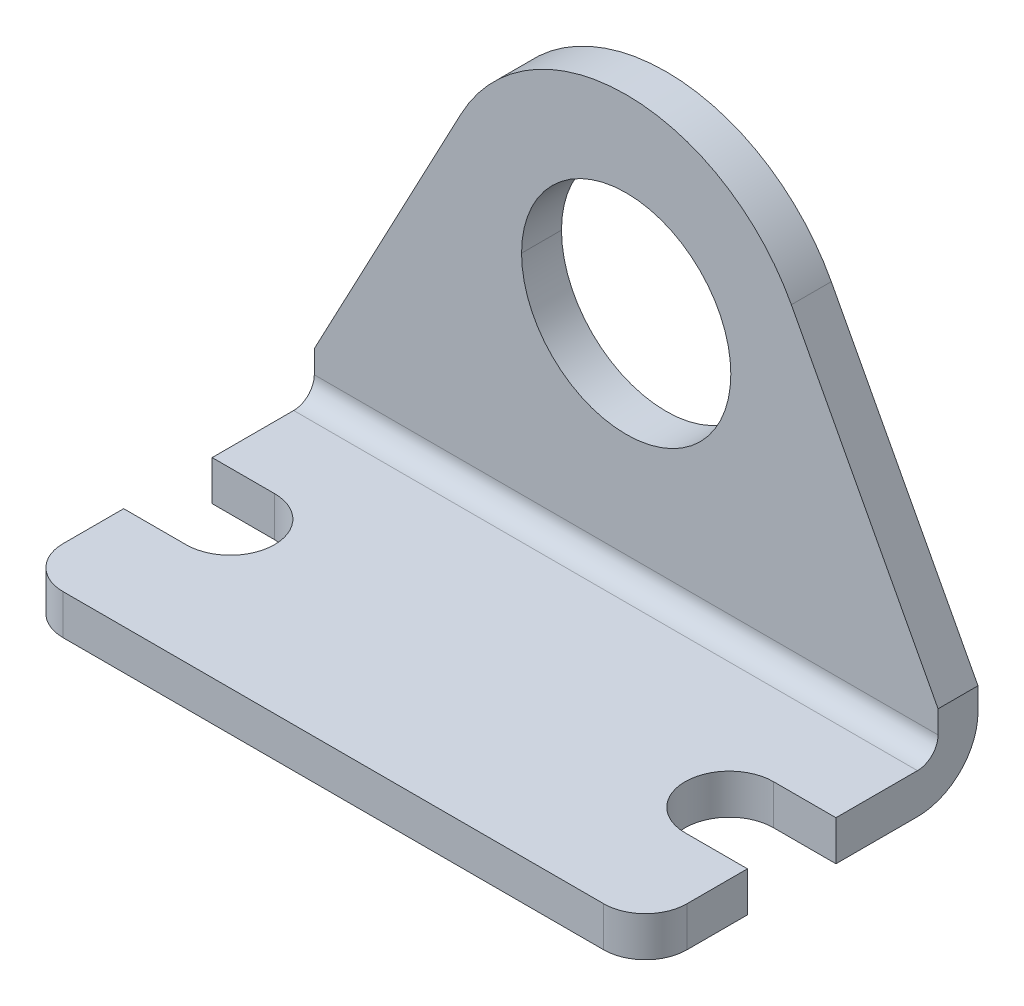
ISO-10303-21;
HEADER;
FILE_DESCRIPTION(('STEP AP214'),'2;1');
FILE_NAME('part.step','',(''),(''),'','','');
FILE_SCHEMA(('AUTOMOTIVE_DESIGN { 1 0 10303 214 1 1 1 1 }'));
ENDSEC;
DATA;
#1=APPLICATION_CONTEXT('core data for automotive mechanical design processes');
#2=APPLICATION_PROTOCOL_DEFINITION('international standard','automotive_design',2000,#1);
#3=PRODUCT_CONTEXT('',#1,'mechanical');
#4=PRODUCT('Part','Part','',(#3));
#5=PRODUCT_RELATED_PRODUCT_CATEGORY('part','',(#4));
#6=PRODUCT_DEFINITION_FORMATION('','',#4);
#7=PRODUCT_DEFINITION_CONTEXT('part definition',#1,'design');
#8=PRODUCT_DEFINITION('design','',#6,#7);
#9=PRODUCT_DEFINITION_SHAPE('','',#8);
#10=(LENGTH_UNIT() NAMED_UNIT(*) SI_UNIT(.MILLI.,.METRE.));
#11=(NAMED_UNIT(*) PLANE_ANGLE_UNIT() SI_UNIT($,.RADIAN.));
#12=(NAMED_UNIT(*) SI_UNIT($,.STERADIAN.) SOLID_ANGLE_UNIT());
#13=UNCERTAINTY_MEASURE_WITH_UNIT(LENGTH_MEASURE(1.E-05),#10,'distance_accuracy_value','');
#14=(GEOMETRIC_REPRESENTATION_CONTEXT(3) GLOBAL_UNCERTAINTY_ASSIGNED_CONTEXT((#13)) GLOBAL_UNIT_ASSIGNED_CONTEXT((#10,
#11,#12)) REPRESENTATION_CONTEXT('',''));
#15=CARTESIAN_POINT('',(0.,0.,0.));
#16=DIRECTION('',(0.,0.,1.));
#17=DIRECTION('',(1.,0.,0.));
#18=AXIS2_PLACEMENT_3D('',#15,#16,#17);
#19=CARTESIAN_POINT('',(42.8625,4.572,17.6022));
#20=DIRECTION('',(0.,0.,-1.));
#21=DIRECTION('',(-1.,0.,0.));
#22=AXIS2_PLACEMENT_3D('',#19,#20,#21);
#23=PLANE('',#22);
#24=DIRECTION('',(1.,0.,0.));
#25=VECTOR('',#24,1.);
#26=CARTESIAN_POINT('',(47.625,3.048,17.6022));
#27=LINE('',#26,#25);
#28=CARTESIAN_POINT('',(42.8625,3.048,17.6022));
#29=VERTEX_POINT('',#28);
#30=CARTESIAN_POINT('',(47.625,3.048,17.6022));
#31=VERTEX_POINT('',#30);
#32=EDGE_CURVE('E11',#29,#31,#27,.T.);
#33=ORIENTED_EDGE('',*,*,#32,.T.);
#34=DIRECTION('',(0.,1.,0.));
#35=VECTOR('',#34,1.);
#36=CARTESIAN_POINT('',(47.625,4.6227999999999,17.6022));
#37=LINE('',#36,#35);
#38=CARTESIAN_POINT('',(47.625,0.,17.6022));
#39=VERTEX_POINT('',#38);
#40=EDGE_CURVE('E25',#39,#31,#37,.T.);
#41=ORIENTED_EDGE('',*,*,#40,.F.);
#42=DIRECTION('',(1.,0.,0.));
#43=VECTOR('',#42,1.);
#44=CARTESIAN_POINT('',(42.8625,0.,17.6022));
#45=LINE('',#44,#43);
#46=CARTESIAN_POINT('',(42.8625,0.,17.6022));
#47=VERTEX_POINT('',#46);
#48=EDGE_CURVE('E461',#47,#39,#45,.T.);
#49=ORIENTED_EDGE('',*,*,#48,.F.);
#50=DIRECTION('',(0.,-1.,0.));
#51=VECTOR('',#50,1.);
#52=CARTESIAN_POINT('',(42.8625,4.572,17.6022));
#53=LINE('',#52,#51);
#54=EDGE_CURVE('E456',#29,#47,#53,.T.);
#55=ORIENTED_EDGE('',*,*,#54,.F.);
#56=EDGE_LOOP('',(#33,#41,#49,#55));
#57=FACE_BOUND('',#56,.T.);
#58=ADVANCED_FACE('F17',(#57),#23,.T.);
#59=CARTESIAN_POINT('',(42.8625,4.572,14.224));
#60=DIRECTION('',(0.,1.,0.));
#61=DIRECTION('',(1.,0.,0.));
#62=AXIS2_PLACEMENT_3D('',#59,#60,#61);
#63=CYLINDRICAL_SURFACE('',#62,3.3782);
#64=DIRECTION('',(0.,-1.,0.));
#65=VECTOR('',#64,1.);
#66=CARTESIAN_POINT('',(42.8625,4.572,10.8458));
#67=LINE('',#66,#65);
#68=CARTESIAN_POINT('',(42.8625,3.048,10.8458));
#69=VERTEX_POINT('',#68);
#70=CARTESIAN_POINT('',(42.8625,0.,10.8458));
#71=VERTEX_POINT('',#70);
#72=EDGE_CURVE('E451',#69,#71,#67,.T.);
#73=ORIENTED_EDGE('',*,*,#72,.F.);
#74=CARTESIAN_POINT('',(42.8625,3.048,14.224));
#75=DIRECTION('',(0.,-1.,0.));
#76=DIRECTION('',(0.,0.,-1.));
#77=AXIS2_PLACEMENT_3D('',#74,#75,#76);
#78=CIRCLE('',#77,3.3782);
#79=EDGE_CURVE('E446',#29,#69,#78,.T.);
#80=ORIENTED_EDGE('',*,*,#79,.F.);
#81=ORIENTED_EDGE('',*,*,#54,.T.);
#82=CARTESIAN_POINT('',(42.8625,0.,14.224));
#83=DIRECTION('',(0.,1.,0.));
#84=DIRECTION('',(1.,0.,0.));
#85=AXIS2_PLACEMENT_3D('',#82,#83,#84);
#86=CIRCLE('',#85,3.3782);
#87=EDGE_CURVE('E441',#71,#47,#86,.T.);
#88=ORIENTED_EDGE('',*,*,#87,.F.);
#89=EDGE_LOOP('',(#73,#80,#81,#88));
#90=FACE_BOUND('',#89,.T.);
#91=ADVANCED_FACE('F476',(#90),#63,.F.);
#92=CARTESIAN_POINT('',(47.625,0.,25.4));
#93=DIRECTION('',(0.,1.,0.));
#94=DIRECTION('',(0.,0.,1.));
#95=AXIS2_PLACEMENT_3D('',#92,#93,#94);
#96=PLANE('',#95);
#97=DIRECTION('',(-1.,0.,0.));
#98=VECTOR('',#97,1.);
#99=CARTESIAN_POINT('',(52.3875,0.,10.8458));
#100=LINE('',#99,#98);
#101=CARTESIAN_POINT('',(47.625,0.,10.8458));
#102=VERTEX_POINT('',#101);
#103=EDGE_CURVE('E436',#102,#71,#100,.T.);
#104=ORIENTED_EDGE('',*,*,#103,.T.);
#105=ORIENTED_EDGE('',*,*,#87,.T.);
#106=ORIENTED_EDGE('',*,*,#48,.T.);
#107=DIRECTION('',(0.,0.,-1.));
#108=VECTOR('',#107,1.);
#109=CARTESIAN_POINT('',(47.625,0.,25.4));
#110=LINE('',#109,#108);
#111=CARTESIAN_POINT('',(47.625,0.,22.225));
#112=VERTEX_POINT('',#111);
#113=EDGE_CURVE('E431',#112,#39,#110,.T.);
#114=ORIENTED_EDGE('',*,*,#113,.F.);
#115=CARTESIAN_POINT('',(44.449999999999,0.,22.224999999999));
#116=DIRECTION('',(0.,1.,0.));
#117=DIRECTION('',(1.,0.,0.));
#118=AXIS2_PLACEMENT_3D('',#115,#116,#117);
#119=CIRCLE('',#118,3.17500000000096);
#120=CARTESIAN_POINT('',(44.449999999999,0.,25.4));
#121=VERTEX_POINT('',#120);
#122=EDGE_CURVE('E426',#121,#112,#119,.T.);
#123=ORIENTED_EDGE('',*,*,#122,.F.);
#124=DIRECTION('',(-1.,0.,0.));
#125=VECTOR('',#124,1.);
#126=CARTESIAN_POINT('',(47.625,0.,25.4));
#127=LINE('',#126,#125);
#128=CARTESIAN_POINT('',(3.175,0.,25.4));
#129=VERTEX_POINT('',#128);
#130=EDGE_CURVE('E422',#121,#129,#127,.T.);
#131=ORIENTED_EDGE('',*,*,#130,.T.);
#132=CARTESIAN_POINT('',(3.17500000000048,0.,22.2249999999995));
#133=DIRECTION('',(0.,1.,0.));
#134=DIRECTION('',(1.,0.,0.));
#135=AXIS2_PLACEMENT_3D('',#132,#133,#134);
#136=CIRCLE('',#135,3.17500000000048);
#137=CARTESIAN_POINT('',(0.,0.,22.2249999526883));
#138=VERTEX_POINT('',#137);
#139=EDGE_CURVE('E417',#138,#129,#136,.T.);
#140=ORIENTED_EDGE('',*,*,#139,.F.);
#141=DIRECTION('',(0.,0.,-1.));
#142=VECTOR('',#141,1.);
#143=CARTESIAN_POINT('',(0.,0.,25.4));
#144=LINE('',#143,#142);
#145=CARTESIAN_POINT('',(0.,0.,17.6022));
#146=VERTEX_POINT('',#145);
#147=EDGE_CURVE('E413',#138,#146,#144,.T.);
#148=ORIENTED_EDGE('',*,*,#147,.T.);
#149=DIRECTION('',(1.,0.,0.));
#150=VECTOR('',#149,1.);
#151=CARTESIAN_POINT('',(-4.7625,0.,17.6022));
#152=LINE('',#151,#150);
#153=CARTESIAN_POINT('',(4.7625,0.,17.6022));
#154=VERTEX_POINT('',#153);
#155=EDGE_CURVE('E409',#146,#154,#152,.T.);
#156=ORIENTED_EDGE('',*,*,#155,.T.);
#157=CARTESIAN_POINT('',(4.7625,0.,14.224));
#158=DIRECTION('',(0.,1.,0.));
#159=DIRECTION('',(1.,0.,0.));
#160=AXIS2_PLACEMENT_3D('',#157,#158,#159);
#161=CIRCLE('',#160,3.3782);
#162=CARTESIAN_POINT('',(4.7625,0.,10.8458));
#163=VERTEX_POINT('',#162);
#164=EDGE_CURVE('E405',#154,#163,#161,.T.);
#165=ORIENTED_EDGE('',*,*,#164,.T.);
#166=DIRECTION('',(-1.,0.,0.));
#167=VECTOR('',#166,1.);
#168=CARTESIAN_POINT('',(4.7625,0.,10.8458));
#169=LINE('',#168,#167);
#170=CARTESIAN_POINT('',(0.,0.,10.8458));
#171=VERTEX_POINT('',#170);
#172=EDGE_CURVE('E401',#163,#171,#169,.T.);
#173=ORIENTED_EDGE('',*,*,#172,.T.);
#174=DIRECTION('',(0.,0.,-1.));
#175=VECTOR('',#174,1.);
#176=CARTESIAN_POINT('',(0.,0.,25.4));
#177=LINE('',#176,#175);
#178=CARTESIAN_POINT('',(0.,0.,4.6228));
#179=VERTEX_POINT('',#178);
#180=EDGE_CURVE('E397',#171,#179,#177,.T.);
#181=ORIENTED_EDGE('',*,*,#180,.T.);
#182=DIRECTION('',(-1.,0.,0.));
#183=VECTOR('',#182,1.);
#184=CARTESIAN_POINT('',(47.625,0.,4.6228));
#185=LINE('',#184,#183);
#186=CARTESIAN_POINT('',(47.625,0.,4.6228));
#187=VERTEX_POINT('',#186);
#188=EDGE_CURVE('E392',#187,#179,#185,.T.);
#189=ORIENTED_EDGE('',*,*,#188,.F.);
#190=DIRECTION('',(0.,0.,-1.));
#191=VECTOR('',#190,1.);
#192=CARTESIAN_POINT('',(47.625,0.,25.4));
#193=LINE('',#192,#191);
#194=EDGE_CURVE('E387',#102,#187,#193,.T.);
#195=ORIENTED_EDGE('',*,*,#194,.F.);
#196=EDGE_LOOP('',(#104,#105,#106,#114,#123,#131,#140,#148,#156,#165,#173,#181,#189,#195));
#197=FACE_BOUND('',#196,.T.);
#198=ADVANCED_FACE('F473',(#197),#96,.F.);
#199=CARTESIAN_POINT('',(47.625,4.6227999999999,4.6227999999999));
#200=DIRECTION('',(1.,0.,0.));
#201=DIRECTION('',(0.,0.,-1.));
#202=AXIS2_PLACEMENT_3D('',#199,#200,#201);
#203=PLANE('',#202);
#204=DIRECTION('',(0.,0.,1.));
#205=VECTOR('',#204,1.);
#206=CARTESIAN_POINT('',(47.625,3.048,4.6228));
#207=LINE('',#206,#205);
#208=CARTESIAN_POINT('',(47.625,3.048,4.62279999999992));
#209=VERTEX_POINT('',#208);
#210=CARTESIAN_POINT('',(47.625,3.048,10.8458));
#211=VERTEX_POINT('',#210);
#212=EDGE_CURVE('E383',#209,#211,#207,.T.);
#213=ORIENTED_EDGE('',*,*,#212,.T.);
#214=DIRECTION('',(0.,-1.,0.));
#215=VECTOR('',#214,1.);
#216=CARTESIAN_POINT('',(47.625,4.6227999999999,10.8458));
#217=LINE('',#216,#215);
#218=EDGE_CURVE('E378',#211,#102,#217,.T.);
#219=ORIENTED_EDGE('',*,*,#218,.T.);
#220=ORIENTED_EDGE('',*,*,#194,.T.);
#221=CARTESIAN_POINT('',(47.625,4.6227999999999,4.6227999999999));
#222=DIRECTION('',(1.,0.,0.));
#223=DIRECTION('',(0.,0.,-1.));
#224=AXIS2_PLACEMENT_3D('',#221,#222,#223);
#225=CIRCLE('',#224,4.6227999999999);
#226=CARTESIAN_POINT('',(47.625,4.6227999999999,0.));
#227=VERTEX_POINT('',#226);
#228=EDGE_CURVE('E374',#187,#227,#225,.T.);
#229=ORIENTED_EDGE('',*,*,#228,.T.);
#230=DIRECTION('',(0.,1.,0.));
#231=VECTOR('',#230,1.);
#232=CARTESIAN_POINT('',(47.625,4.6228,0.));
#233=LINE('',#232,#231);
#234=CARTESIAN_POINT('',(47.625,6.35000000000005,0.));
#235=VERTEX_POINT('',#234);
#236=EDGE_CURVE('E370',#227,#235,#233,.T.);
#237=ORIENTED_EDGE('',*,*,#236,.T.);
#238=DIRECTION('',(0.,0.,-1.));
#239=VECTOR('',#238,1.);
#240=CARTESIAN_POINT('',(47.625,6.35000000000005,4.6227999999999));
#241=LINE('',#240,#239);
#242=CARTESIAN_POINT('',(47.625,6.35000000000005,3.048));
#243=VERTEX_POINT('',#242);
#244=EDGE_CURVE('E365',#243,#235,#241,.T.);
#245=ORIENTED_EDGE('',*,*,#244,.F.);
#246=DIRECTION('',(0.,-1.,0.));
#247=VECTOR('',#246,1.);
#248=CARTESIAN_POINT('',(47.625,42.0624,3.048));
#249=LINE('',#248,#247);
#250=CARTESIAN_POINT('',(47.625,4.6228,3.048));
#251=VERTEX_POINT('',#250);
#252=EDGE_CURVE('E361',#243,#251,#249,.T.);
#253=ORIENTED_EDGE('',*,*,#252,.T.);
#254=CARTESIAN_POINT('',(47.625,4.62279999999992,4.62279999999992));
#255=DIRECTION('',(1.,0.,0.));
#256=DIRECTION('',(0.,0.,-1.));
#257=AXIS2_PLACEMENT_3D('',#254,#255,#256);
#258=CIRCLE('',#257,1.57479999999991);
#259=EDGE_CURVE('E356',#209,#251,#258,.T.);
#260=ORIENTED_EDGE('',*,*,#259,.F.);
#261=EDGE_LOOP('',(#213,#219,#220,#229,#237,#245,#253,#260));
#262=FACE_BOUND('',#261,.T.);
#263=ADVANCED_FACE('F516',(#262),#203,.T.);
#264=CARTESIAN_POINT('',(47.625,4.62279999999992,4.62279999999992));
#265=DIRECTION('',(1.,0.,0.));
#266=DIRECTION('',(0.,0.70710678118653,0.707106781186565));
#267=AXIS2_PLACEMENT_3D('',#264,#265,#266);
#268=CYLINDRICAL_SURFACE('',#267,1.57479999999991);
#269=DIRECTION('',(-1.,0.,0.));
#270=VECTOR('',#269,1.);
#271=CARTESIAN_POINT('',(47.625,4.6228,3.048));
#272=LINE('',#271,#270);
#273=CARTESIAN_POINT('',(0.,4.6228,3.048));
#274=VERTEX_POINT('',#273);
#275=EDGE_CURVE('E352',#251,#274,#272,.T.);
#276=ORIENTED_EDGE('',*,*,#275,.T.);
#277=CARTESIAN_POINT('',(0.,4.62279999999992,4.62279999999992));
#278=DIRECTION('',(1.,0.,0.));
#279=DIRECTION('',(0.,0.,-1.));
#280=AXIS2_PLACEMENT_3D('',#277,#278,#279);
#281=CIRCLE('',#280,1.57479999999991);
#282=CARTESIAN_POINT('',(0.,3.048,4.62279999999992));
#283=VERTEX_POINT('',#282);
#284=EDGE_CURVE('E347',#283,#274,#281,.T.);
#285=ORIENTED_EDGE('',*,*,#284,.F.);
#286=DIRECTION('',(-1.,0.,0.));
#287=VECTOR('',#286,1.);
#288=CARTESIAN_POINT('',(47.625,3.048,4.62279999999992));
#289=LINE('',#288,#287);
#290=EDGE_CURVE('E342',#209,#283,#289,.T.);
#291=ORIENTED_EDGE('',*,*,#290,.F.);
#292=ORIENTED_EDGE('',*,*,#259,.T.);
#293=EDGE_LOOP('',(#276,#285,#291,#292));
#294=FACE_BOUND('',#293,.T.);
#295=ADVANCED_FACE('F529',(#294),#268,.F.);
#296=CARTESIAN_POINT('',(47.625,3.048,4.6228));
#297=DIRECTION('',(0.,-1.,0.));
#298=DIRECTION('',(0.,0.,-1.));
#299=AXIS2_PLACEMENT_3D('',#296,#297,#298);
#300=PLANE('',#299);
#301=DIRECTION('',(-1.,0.,0.));
#302=VECTOR('',#301,1.);
#303=CARTESIAN_POINT('',(47.625,3.048,10.8458));
#304=LINE('',#303,#302);
#305=EDGE_CURVE('E337',#211,#69,#304,.T.);
#306=ORIENTED_EDGE('',*,*,#305,.F.);
#307=ORIENTED_EDGE('',*,*,#212,.F.);
#308=ORIENTED_EDGE('',*,*,#290,.T.);
#309=DIRECTION('',(0.,0.,1.));
#310=VECTOR('',#309,1.);
#311=CARTESIAN_POINT('',(0.,3.048,4.6228));
#312=LINE('',#311,#310);
#313=CARTESIAN_POINT('',(0.,3.048,10.8458));
#314=VERTEX_POINT('',#313);
#315=EDGE_CURVE('E333',#283,#314,#312,.T.);
#316=ORIENTED_EDGE('',*,*,#315,.T.);
#317=DIRECTION('',(-1.,0.,0.));
#318=VECTOR('',#317,1.);
#319=CARTESIAN_POINT('',(47.625,3.048,10.8458));
#320=LINE('',#319,#318);
#321=CARTESIAN_POINT('',(4.7625,3.048,10.8458));
#322=VERTEX_POINT('',#321);
#323=EDGE_CURVE('E328',#322,#314,#320,.T.);
#324=ORIENTED_EDGE('',*,*,#323,.F.);
#325=CARTESIAN_POINT('',(4.7625,3.048,14.224));
#326=DIRECTION('',(0.,-1.,0.));
#327=DIRECTION('',(0.,0.,-1.));
#328=AXIS2_PLACEMENT_3D('',#325,#326,#327);
#329=CIRCLE('',#328,3.3782);
#330=CARTESIAN_POINT('',(4.7625,3.048,17.6022));
#331=VERTEX_POINT('',#330);
#332=EDGE_CURVE('E324',#322,#331,#329,.T.);
#333=ORIENTED_EDGE('',*,*,#332,.T.);
#334=DIRECTION('',(1.,0.,0.));
#335=VECTOR('',#334,1.);
#336=CARTESIAN_POINT('',(47.625,3.048,17.6022));
#337=LINE('',#336,#335);
#338=CARTESIAN_POINT('',(0.,3.048,17.6022));
#339=VERTEX_POINT('',#338);
#340=EDGE_CURVE('E319',#339,#331,#337,.T.);
#341=ORIENTED_EDGE('',*,*,#340,.F.);
#342=DIRECTION('',(0.,0.,1.));
#343=VECTOR('',#342,1.);
#344=CARTESIAN_POINT('',(0.,3.048,4.6228));
#345=LINE('',#344,#343);
#346=CARTESIAN_POINT('',(0.,3.048,22.225));
#347=VERTEX_POINT('',#346);
#348=EDGE_CURVE('E315',#339,#347,#345,.T.);
#349=ORIENTED_EDGE('',*,*,#348,.T.);
#350=CARTESIAN_POINT('',(3.17500000000048,3.048,22.2249999999995));
#351=DIRECTION('',(0.,-1.,0.));
#352=DIRECTION('',(0.,0.,-1.));
#353=AXIS2_PLACEMENT_3D('',#350,#351,#352);
#354=CIRCLE('',#353,3.17500000000048);
#355=CARTESIAN_POINT('',(3.175,3.048,25.4));
#356=VERTEX_POINT('',#355);
#357=EDGE_CURVE('E310',#356,#347,#354,.T.);
#358=ORIENTED_EDGE('',*,*,#357,.F.);
#359=DIRECTION('',(-1.,0.,0.));
#360=VECTOR('',#359,1.);
#361=CARTESIAN_POINT('',(47.625,3.048,25.4));
#362=LINE('',#361,#360);
#363=CARTESIAN_POINT('',(44.449999999999,3.048,25.4));
#364=VERTEX_POINT('',#363);
#365=EDGE_CURVE('E305',#364,#356,#362,.T.);
#366=ORIENTED_EDGE('',*,*,#365,.F.);
#367=CARTESIAN_POINT('',(44.449999999999,3.048,22.224999999999));
#368=DIRECTION('',(0.,-1.,0.));
#369=DIRECTION('',(0.,0.,-1.));
#370=AXIS2_PLACEMENT_3D('',#367,#368,#369);
#371=CIRCLE('',#370,3.17500000000096);
#372=CARTESIAN_POINT('',(47.625,3.048,22.225));
#373=VERTEX_POINT('',#372);
#374=EDGE_CURVE('E300',#373,#364,#371,.T.);
#375=ORIENTED_EDGE('',*,*,#374,.F.);
#376=DIRECTION('',(0.,0.,1.));
#377=VECTOR('',#376,1.);
#378=CARTESIAN_POINT('',(47.625,3.048,4.6228));
#379=LINE('',#378,#377);
#380=EDGE_CURVE('E295',#31,#373,#379,.T.);
#381=ORIENTED_EDGE('',*,*,#380,.F.);
#382=ORIENTED_EDGE('',*,*,#32,.F.);
#383=ORIENTED_EDGE('',*,*,#79,.T.);
#384=EDGE_LOOP('',(#306,#307,#308,#316,#324,#333,#341,#349,#358,#366,#375,#381,#382,#383));
#385=FACE_BOUND('',#384,.T.);
#386=ADVANCED_FACE('F479',(#385),#300,.F.);
#387=CARTESIAN_POINT('',(47.625,4.6227999999999,4.6227999999999));
#388=DIRECTION('',(1.,0.,0.));
#389=DIRECTION('',(0.,0.,-1.));
#390=AXIS2_PLACEMENT_3D('',#387,#388,#389);
#391=PLANE('',#390);
#392=ORIENTED_EDGE('',*,*,#113,.T.);
#393=ORIENTED_EDGE('',*,*,#40,.T.);
#394=ORIENTED_EDGE('',*,*,#380,.T.);
#395=DIRECTION('',(0.,-1.,0.));
#396=VECTOR('',#395,1.);
#397=CARTESIAN_POINT('',(47.625,4.572,22.224999999999));
#398=LINE('',#397,#396);
#399=EDGE_CURVE('E290',#373,#112,#398,.T.);
#400=ORIENTED_EDGE('',*,*,#399,.T.);
#401=EDGE_LOOP('',(#392,#393,#394,#400));
#402=FACE_BOUND('',#401,.T.);
#403=ADVANCED_FACE('F470',(#402),#391,.T.);
#404=CARTESIAN_POINT('',(44.449999999999,4.572,22.224999999999));
#405=DIRECTION('',(0.,1.,0.));
#406=DIRECTION('',(-0.707106781186547,0.,-0.707106781186548));
#407=AXIS2_PLACEMENT_3D('',#404,#405,#406);
#408=CYLINDRICAL_SURFACE('',#407,3.17500000000096);
#409=DIRECTION('',(0.,-1.,0.));
#410=VECTOR('',#409,1.);
#411=CARTESIAN_POINT('',(44.449999999999,4.572,25.4));
#412=LINE('',#411,#410);
#413=EDGE_CURVE('E285',#364,#121,#412,.T.);
#414=ORIENTED_EDGE('',*,*,#413,.T.);
#415=ORIENTED_EDGE('',*,*,#122,.T.);
#416=ORIENTED_EDGE('',*,*,#399,.F.);
#417=ORIENTED_EDGE('',*,*,#374,.T.);
#418=EDGE_LOOP('',(#414,#415,#416,#417));
#419=FACE_BOUND('',#418,.T.);
#420=ADVANCED_FACE('F482',(#419),#408,.T.);
#421=CARTESIAN_POINT('',(47.625,3.048,25.4));
#422=DIRECTION('',(0.,0.,-1.));
#423=DIRECTION('',(-1.,0.,0.));
#424=AXIS2_PLACEMENT_3D('',#421,#422,#423);
#425=PLANE('',#424);
#426=ORIENTED_EDGE('',*,*,#130,.F.);
#427=ORIENTED_EDGE('',*,*,#413,.F.);
#428=ORIENTED_EDGE('',*,*,#365,.T.);
#429=DIRECTION('',(0.,-1.,0.));
#430=VECTOR('',#429,1.);
#431=CARTESIAN_POINT('',(3.175,4.572,25.4));
#432=LINE('',#431,#430);
#433=EDGE_CURVE('E280',#356,#129,#432,.T.);
#434=ORIENTED_EDGE('',*,*,#433,.T.);
#435=EDGE_LOOP('',(#426,#427,#428,#434));
#436=FACE_BOUND('',#435,.T.);
#437=ADVANCED_FACE('F485',(#436),#425,.F.);
#438=CARTESIAN_POINT('',(3.17500000000048,4.572,22.2249999999995));
#439=DIRECTION('',(0.,1.,0.));
#440=DIRECTION('',(0.707106786454957,0.,-0.707106775918138));
#441=AXIS2_PLACEMENT_3D('',#438,#439,#440);
#442=CYLINDRICAL_SURFACE('',#441,3.17500000000048);
#443=DIRECTION('',(0.,-1.,0.));
#444=VECTOR('',#443,1.);
#445=CARTESIAN_POINT('',(0.,4.6227999999999,22.225));
#446=LINE('',#445,#444);
#447=EDGE_CURVE('E275',#347,#138,#446,.T.);
#448=ORIENTED_EDGE('',*,*,#447,.T.);
#449=ORIENTED_EDGE('',*,*,#139,.T.);
#450=ORIENTED_EDGE('',*,*,#433,.F.);
#451=ORIENTED_EDGE('',*,*,#357,.T.);
#452=EDGE_LOOP('',(#448,#449,#450,#451));
#453=FACE_BOUND('',#452,.T.);
#454=ADVANCED_FACE('F491',(#453),#442,.T.);
#455=CARTESIAN_POINT('',(0.,4.6227999999999,4.6227999999999));
#456=DIRECTION('',(1.,0.,0.));
#457=DIRECTION('',(0.,0.,-1.));
#458=AXIS2_PLACEMENT_3D('',#455,#456,#457);
#459=PLANE('',#458);
#460=DIRECTION('',(0.,1.,0.));
#461=VECTOR('',#460,1.);
#462=CARTESIAN_POINT('',(0.,4.6227999999999,17.6022));
#463=LINE('',#462,#461);
#464=EDGE_CURVE('E270',#146,#339,#463,.T.);
#465=ORIENTED_EDGE('',*,*,#464,.F.);
#466=ORIENTED_EDGE('',*,*,#147,.F.);
#467=ORIENTED_EDGE('',*,*,#447,.F.);
#468=ORIENTED_EDGE('',*,*,#348,.F.);
#469=EDGE_LOOP('',(#465,#466,#467,#468));
#470=FACE_BOUND('',#469,.T.);
#471=ADVANCED_FACE('F494',(#470),#459,.F.);
#472=CARTESIAN_POINT('',(-4.7625,4.572,17.6022));
#473=DIRECTION('',(0.,0.,-1.));
#474=DIRECTION('',(-1.,0.,0.));
#475=AXIS2_PLACEMENT_3D('',#472,#473,#474);
#476=PLANE('',#475);
#477=ORIENTED_EDGE('',*,*,#340,.T.);
#478=DIRECTION('',(0.,-1.,0.));
#479=VECTOR('',#478,1.);
#480=CARTESIAN_POINT('',(4.7625,4.572,17.6022));
#481=LINE('',#480,#479);
#482=EDGE_CURVE('E265',#331,#154,#481,.T.);
#483=ORIENTED_EDGE('',*,*,#482,.T.);
#484=ORIENTED_EDGE('',*,*,#155,.F.);
#485=ORIENTED_EDGE('',*,*,#464,.T.);
#486=EDGE_LOOP('',(#477,#483,#484,#485));
#487=FACE_BOUND('',#486,.T.);
#488=ADVANCED_FACE('F497',(#487),#476,.T.);
#489=CARTESIAN_POINT('',(4.7625,4.572,14.224));
#490=DIRECTION('',(0.,1.,0.));
#491=DIRECTION('',(-1.,0.,0.));
#492=AXIS2_PLACEMENT_3D('',#489,#490,#491);
#493=CYLINDRICAL_SURFACE('',#492,3.3782);
#494=ORIENTED_EDGE('',*,*,#482,.F.);
#495=ORIENTED_EDGE('',*,*,#332,.F.);
#496=DIRECTION('',(0.,-1.,0.));
#497=VECTOR('',#496,1.);
#498=CARTESIAN_POINT('',(4.7625,4.572,10.8458));
#499=LINE('',#498,#497);
#500=EDGE_CURVE('E260',#322,#163,#499,.T.);
#501=ORIENTED_EDGE('',*,*,#500,.T.);
#502=ORIENTED_EDGE('',*,*,#164,.F.);
#503=EDGE_LOOP('',(#494,#495,#501,#502));
#504=FACE_BOUND('',#503,.T.);
#505=ADVANCED_FACE('F504',(#504),#493,.F.);
#506=CARTESIAN_POINT('',(4.7625,4.572,10.8458));
#507=DIRECTION('',(0.,0.,1.));
#508=DIRECTION('',(1.,0.,0.));
#509=AXIS2_PLACEMENT_3D('',#506,#507,#508);
#510=PLANE('',#509);
#511=ORIENTED_EDGE('',*,*,#323,.T.);
#512=DIRECTION('',(0.,-1.,0.));
#513=VECTOR('',#512,1.);
#514=CARTESIAN_POINT('',(0.,4.6227999999999,10.8458));
#515=LINE('',#514,#513);
#516=EDGE_CURVE('E255',#314,#171,#515,.T.);
#517=ORIENTED_EDGE('',*,*,#516,.T.);
#518=ORIENTED_EDGE('',*,*,#172,.F.);
#519=ORIENTED_EDGE('',*,*,#500,.F.);
#520=EDGE_LOOP('',(#511,#517,#518,#519));
#521=FACE_BOUND('',#520,.T.);
#522=ADVANCED_FACE('F506',(#521),#510,.T.);
#523=CARTESIAN_POINT('',(0.,4.6227999999999,4.6227999999999));
#524=DIRECTION('',(1.,0.,0.));
#525=DIRECTION('',(0.,0.,-1.));
#526=AXIS2_PLACEMENT_3D('',#523,#524,#525);
#527=PLANE('',#526);
#528=ORIENTED_EDGE('',*,*,#516,.F.);
#529=ORIENTED_EDGE('',*,*,#315,.F.);
#530=ORIENTED_EDGE('',*,*,#284,.T.);
#531=DIRECTION('',(0.,-1.,0.));
#532=VECTOR('',#531,1.);
#533=CARTESIAN_POINT('',(0.,42.0624,3.048));
#534=LINE('',#533,#532);
#535=CARTESIAN_POINT('',(0.,6.34999999999975,3.048));
#536=VERTEX_POINT('',#535);
#537=EDGE_CURVE('E251',#536,#274,#534,.T.);
#538=ORIENTED_EDGE('',*,*,#537,.F.);
#539=DIRECTION('',(0.,0.,-1.));
#540=VECTOR('',#539,1.);
#541=CARTESIAN_POINT('',(0.,6.34999999999975,4.6227999999999));
#542=LINE('',#541,#540);
#543=CARTESIAN_POINT('',(0.,6.34999999999975,0.));
#544=VERTEX_POINT('',#543);
#545=EDGE_CURVE('E183',#536,#544,#542,.T.);
#546=ORIENTED_EDGE('',*,*,#545,.T.);
#547=DIRECTION('',(0.,1.,0.));
#548=VECTOR('',#547,1.);
#549=CARTESIAN_POINT('',(0.,4.6228,0.));
#550=LINE('',#549,#548);
#551=CARTESIAN_POINT('',(0.,4.6227999999999,0.));
#552=VERTEX_POINT('',#551);
#553=EDGE_CURVE('E243',#552,#544,#550,.T.);
#554=ORIENTED_EDGE('',*,*,#553,.F.);
#555=CARTESIAN_POINT('',(0.,4.6227999999999,4.6227999999999));
#556=DIRECTION('',(1.,0.,0.));
#557=DIRECTION('',(0.,0.,-1.));
#558=AXIS2_PLACEMENT_3D('',#555,#556,#557);
#559=CIRCLE('',#558,4.6227999999999);
#560=EDGE_CURVE('E238',#179,#552,#559,.T.);
#561=ORIENTED_EDGE('',*,*,#560,.F.);
#562=ORIENTED_EDGE('',*,*,#180,.F.);
#563=EDGE_LOOP('',(#528,#529,#530,#538,#546,#554,#561,#562));
#564=FACE_BOUND('',#563,.T.);
#565=ADVANCED_FACE('F512',(#564),#527,.F.);
#566=CARTESIAN_POINT('',(47.625,4.6227999999999,4.6227999999999));
#567=DIRECTION('',(1.,0.,0.));
#568=DIRECTION('',(0.,0.707106781186555,0.70710678118654));
#569=AXIS2_PLACEMENT_3D('',#566,#567,#568);
#570=CYLINDRICAL_SURFACE('',#569,4.6227999999999);
#571=ORIENTED_EDGE('',*,*,#560,.T.);
#572=DIRECTION('',(-1.,0.,0.));
#573=VECTOR('',#572,1.);
#574=CARTESIAN_POINT('',(47.625,4.6227999999999,0.));
#575=LINE('',#574,#573);
#576=EDGE_CURVE('E233',#227,#552,#575,.T.);
#577=ORIENTED_EDGE('',*,*,#576,.F.);
#578=ORIENTED_EDGE('',*,*,#228,.F.);
#579=ORIENTED_EDGE('',*,*,#188,.T.);
#580=EDGE_LOOP('',(#571,#577,#578,#579));
#581=FACE_BOUND('',#580,.T.);
#582=ADVANCED_FACE('F520',(#581),#570,.T.);
#583=CARTESIAN_POINT('',(47.625,4.6228,0.));
#584=DIRECTION('',(0.,0.,1.));
#585=DIRECTION('',(1.,0.,0.));
#586=AXIS2_PLACEMENT_3D('',#583,#584,#585);
#587=PLANE('',#586);
#588=CARTESIAN_POINT('',(23.8125,20.574,0.));
#589=DIRECTION('',(0.,0.,1.));
#590=DIRECTION('',(1.,0.,0.));
#591=AXIS2_PLACEMENT_3D('',#588,#589,#590);
#592=CIRCLE('',#591,7.9883);
#593=CARTESIAN_POINT('',(31.8008,20.574,0.));
#594=VERTEX_POINT('',#593);
#595=CARTESIAN_POINT('',(15.8242,20.574,0.));
#596=VERTEX_POINT('',#595);
#597=EDGE_CURVE('E229',#594,#596,#592,.T.);
#598=ORIENTED_EDGE('',*,*,#597,.T.);
#599=CARTESIAN_POINT('',(23.8125,20.574,0.));
#600=DIRECTION('',(0.,0.,1.));
#601=DIRECTION('',(1.,0.,0.));
#602=AXIS2_PLACEMENT_3D('',#599,#600,#601);
#603=CIRCLE('',#602,7.9883);
#604=EDGE_CURVE('E225',#596,#594,#603,.T.);
#605=ORIENTED_EDGE('',*,*,#604,.T.);
#606=EDGE_LOOP('',(#598,#605));
#607=FACE_BOUND('',#606,.T.);
#608=ORIENTED_EDGE('',*,*,#553,.T.);
#609=DIRECTION('',(-0.4686305129376,-0.883394273438447,0.));
#610=VECTOR('',#609,1.);
#611=CARTESIAN_POINT('',(11.202223425521,27.4668068460811,0.));
#612=LINE('',#611,#610);
#613=CARTESIAN_POINT('',(11.202223425521,27.4668068460811,0.));
#614=VERTEX_POINT('',#613);
#615=EDGE_CURVE('E221',#614,#544,#612,.T.);
#616=ORIENTED_EDGE('',*,*,#615,.F.);
#617=CARTESIAN_POINT('',(23.8125,20.7772000000008,0.));
#618=DIRECTION('',(0.,0.,1.));
#619=DIRECTION('',(1.,0.,0.));
#620=AXIS2_PLACEMENT_3D('',#617,#618,#619);
#621=CIRCLE('',#620,14.2747999999992);
#622=CARTESIAN_POINT('',(36.422776574479,27.4668068460811,0.));
#623=VERTEX_POINT('',#622);
#624=EDGE_CURVE('E186',#623,#614,#621,.T.);
#625=ORIENTED_EDGE('',*,*,#624,.F.);
#626=DIRECTION('',(-0.468630512937605,0.883394273438445,0.));
#627=VECTOR('',#626,1.);
#628=CARTESIAN_POINT('',(50.9936020462541,0.,0.));
#629=LINE('',#628,#627);
#630=EDGE_CURVE('E213',#235,#623,#629,.T.);
#631=ORIENTED_EDGE('',*,*,#630,.F.);
#632=ORIENTED_EDGE('',*,*,#236,.F.);
#633=ORIENTED_EDGE('',*,*,#576,.T.);
#634=EDGE_LOOP('',(#608,#616,#625,#631,#632,#633));
#635=FACE_BOUND('',#634,.T.);
#636=ADVANCED_FACE('F524',(#607,#635),#587,.F.);
#637=CARTESIAN_POINT('',(50.9936020462541,0.,4.572));
#638=DIRECTION('',(-0.883394273438445,-0.468630512937605,0.));
#639=DIRECTION('',(0.468630512937605,-0.883394273438445,0.));
#640=AXIS2_PLACEMENT_3D('',#637,#638,#639);
#641=PLANE('',#640);
#642=ORIENTED_EDGE('',*,*,#244,.T.);
#643=ORIENTED_EDGE('',*,*,#630,.T.);
#644=DIRECTION('',(0.,0.,-1.));
#645=VECTOR('',#644,1.);
#646=CARTESIAN_POINT('',(36.422776574479,27.4668068460811,4.572));
#647=LINE('',#646,#645);
#648=CARTESIAN_POINT('',(36.422776574479,27.4668068460811,3.048));
#649=VERTEX_POINT('',#648);
#650=EDGE_CURVE('E209',#649,#623,#647,.T.);
#651=ORIENTED_EDGE('',*,*,#650,.F.);
#652=DIRECTION('',(-0.468630512937605,0.883394273438445,0.));
#653=VECTOR('',#652,1.);
#654=CARTESIAN_POINT('',(32.8405838195501,34.2194370711602,3.048));
#655=LINE('',#654,#653);
#656=EDGE_CURVE('E171',#243,#649,#655,.T.);
#657=ORIENTED_EDGE('',*,*,#656,.F.);
#658=EDGE_LOOP('',(#642,#643,#651,#657));
#659=FACE_BOUND('',#658,.T.);
#660=ADVANCED_FACE('F526',(#659),#641,.F.);
#661=CARTESIAN_POINT('',(47.625,42.0624,3.048));
#662=DIRECTION('',(0.,0.,-1.));
#663=DIRECTION('',(-1.,0.,0.));
#664=AXIS2_PLACEMENT_3D('',#661,#662,#663);
#665=PLANE('',#664);
#666=CARTESIAN_POINT('',(23.8125,20.574,3.048));
#667=DIRECTION('',(0.,0.,-1.));
#668=DIRECTION('',(-1.,0.,0.));
#669=AXIS2_PLACEMENT_3D('',#666,#667,#668);
#670=CIRCLE('',#669,7.9883);
#671=CARTESIAN_POINT('',(15.8242,20.574,3.048));
#672=VERTEX_POINT('',#671);
#673=CARTESIAN_POINT('',(31.8008,20.574,3.048));
#674=VERTEX_POINT('',#673);
#675=EDGE_CURVE('E202',#672,#674,#670,.T.);
#676=ORIENTED_EDGE('',*,*,#675,.T.);
#677=CARTESIAN_POINT('',(23.8125,20.574,3.048));
#678=DIRECTION('',(0.,0.,-1.));
#679=DIRECTION('',(-1.,0.,0.));
#680=AXIS2_PLACEMENT_3D('',#677,#678,#679);
#681=CIRCLE('',#680,7.9883);
#682=EDGE_CURVE('E175',#674,#672,#681,.T.);
#683=ORIENTED_EDGE('',*,*,#682,.T.);
#684=EDGE_LOOP('',(#676,#683));
#685=FACE_BOUND('',#684,.T.);
#686=CARTESIAN_POINT('',(23.8125,20.7772000000008,3.048));
#687=DIRECTION('',(0.,0.,-1.));
#688=DIRECTION('',(-1.,0.,0.));
#689=AXIS2_PLACEMENT_3D('',#686,#687,#688);
#690=CIRCLE('',#689,14.2747999999992);
#691=CARTESIAN_POINT('',(11.202223425521,27.4668068460811,3.048));
#692=VERTEX_POINT('',#691);
#693=EDGE_CURVE('E163',#692,#649,#690,.T.);
#694=ORIENTED_EDGE('',*,*,#693,.F.);
#695=DIRECTION('',(-0.4686305129376,-0.883394273438447,0.));
#696=VECTOR('',#695,1.);
#697=CARTESIAN_POINT('',(25.2435594888243,53.9354970557571,3.048));
#698=LINE('',#697,#696);
#699=EDGE_CURVE('E167',#692,#536,#698,.T.);
#700=ORIENTED_EDGE('',*,*,#699,.T.);
#701=ORIENTED_EDGE('',*,*,#537,.T.);
#702=ORIENTED_EDGE('',*,*,#275,.F.);
#703=ORIENTED_EDGE('',*,*,#252,.F.);
#704=ORIENTED_EDGE('',*,*,#656,.T.);
#705=EDGE_LOOP('',(#694,#700,#701,#702,#703,#704));
#706=FACE_BOUND('',#705,.T.);
#707=ADVANCED_FACE('F165',(#685,#706),#665,.F.);
#708=CARTESIAN_POINT('',(11.202223425521,27.4668068460811,4.572));
#709=DIRECTION('',(0.883394273438447,-0.4686305129376,0.));
#710=DIRECTION('',(0.4686305129376,0.883394273438447,0.));
#711=AXIS2_PLACEMENT_3D('',#708,#709,#710);
#712=PLANE('',#711);
#713=DIRECTION('',(0.,0.,-1.));
#714=VECTOR('',#713,1.);
#715=CARTESIAN_POINT('',(11.202223425521,27.4668068460811,4.572));
#716=LINE('',#715,#714);
#717=EDGE_CURVE('E181',#692,#614,#716,.T.);
#718=ORIENTED_EDGE('',*,*,#717,.T.);
#719=ORIENTED_EDGE('',*,*,#615,.T.);
#720=ORIENTED_EDGE('',*,*,#545,.F.);
#721=ORIENTED_EDGE('',*,*,#699,.F.);
#722=EDGE_LOOP('',(#718,#719,#720,#721));
#723=FACE_BOUND('',#722,.T.);
#724=ADVANCED_FACE('F179',(#723),#712,.F.);
#725=CARTESIAN_POINT('',(23.8125,20.7772000000008,4.572));
#726=DIRECTION('',(0.,0.,1.));
#727=DIRECTION('',(0.,-1.,0.));
#728=AXIS2_PLACEMENT_3D('',#725,#726,#727);
#729=CYLINDRICAL_SURFACE('',#728,14.2747999999992);
#730=ORIENTED_EDGE('',*,*,#650,.T.);
#731=ORIENTED_EDGE('',*,*,#624,.T.);
#732=ORIENTED_EDGE('',*,*,#717,.F.);
#733=ORIENTED_EDGE('',*,*,#693,.T.);
#734=EDGE_LOOP('',(#730,#731,#732,#733));
#735=FACE_BOUND('',#734,.T.);
#736=ADVANCED_FACE('F185',(#735),#729,.T.);
#737=CARTESIAN_POINT('',(23.8125,20.574,4.572));
#738=DIRECTION('',(0.,0.,1.));
#739=DIRECTION('',(0.,1.,0.));
#740=AXIS2_PLACEMENT_3D('',#737,#738,#739);
#741=CYLINDRICAL_SURFACE('',#740,7.9883);
#742=ORIENTED_EDGE('',*,*,#682,.F.);
#743=CARTESIAN_POINT('',(31.8008,20.574,0.));
#744=DIRECTION('',(0.,0.,1.));
#745=VECTOR('',#744,1.);
#746=LINE('',#743,#745);
#747=EDGE_CURVE('E187',#594,#674,#746,.T.);
#748=ORIENTED_EDGE('',*,*,#747,.F.);
#749=ORIENTED_EDGE('',*,*,#604,.F.);
#750=CARTESIAN_POINT('',(15.8242,20.574,0.));
#751=DIRECTION('',(0.,0.,1.));
#752=VECTOR('',#751,1.);
#753=LINE('',#750,#752);
#754=EDGE_CURVE('E190',#596,#672,#753,.T.);
#755=ORIENTED_EDGE('',*,*,#754,.T.);
#756=EDGE_LOOP('',(#742,#748,#749,#755));
#757=FACE_BOUND('',#756,.T.);
#758=ADVANCED_FACE('F541',(#757),#741,.F.);
#759=CARTESIAN_POINT('',(23.8125,20.574,4.572));
#760=DIRECTION('',(0.,0.,1.));
#761=DIRECTION('',(0.,-1.,0.));
#762=AXIS2_PLACEMENT_3D('',#759,#760,#761);
#763=CYLINDRICAL_SURFACE('',#762,7.9883);
#764=ORIENTED_EDGE('',*,*,#597,.F.);
#765=ORIENTED_EDGE('',*,*,#747,.T.);
#766=ORIENTED_EDGE('',*,*,#675,.F.);
#767=ORIENTED_EDGE('',*,*,#754,.F.);
#768=EDGE_LOOP('',(#764,#765,#766,#767));
#769=FACE_BOUND('',#768,.T.);
#770=ADVANCED_FACE('F535',(#769),#763,.F.);
#771=CARTESIAN_POINT('',(52.3875,4.572,10.8458));
#772=DIRECTION('',(0.,0.,1.));
#773=DIRECTION('',(1.,0.,0.));
#774=AXIS2_PLACEMENT_3D('',#771,#772,#773);
#775=PLANE('',#774);
#776=ORIENTED_EDGE('',*,*,#305,.T.);
#777=ORIENTED_EDGE('',*,*,#72,.T.);
#778=ORIENTED_EDGE('',*,*,#103,.F.);
#779=ORIENTED_EDGE('',*,*,#218,.F.);
#780=EDGE_LOOP('',(#776,#777,#778,#779));
#781=FACE_BOUND('',#780,.T.);
#782=ADVANCED_FACE('F533',(#781),#775,.T.);
#783=CLOSED_SHELL('',(#58,#91,#198,#263,#295,#386,#403,#420,#437,#454,#471,#488,#505,#522,#565,
#582,#636,#660,#707,#724,#736,#758,#770,#782));
#784=MANIFOLD_SOLID_BREP('B1',#783);
#785=ADVANCED_BREP_SHAPE_REPRESENTATION('',(#18,#784),#14);
#786=SHAPE_DEFINITION_REPRESENTATION(#9,#785);
ENDSEC;
END-ISO-10303-21;
